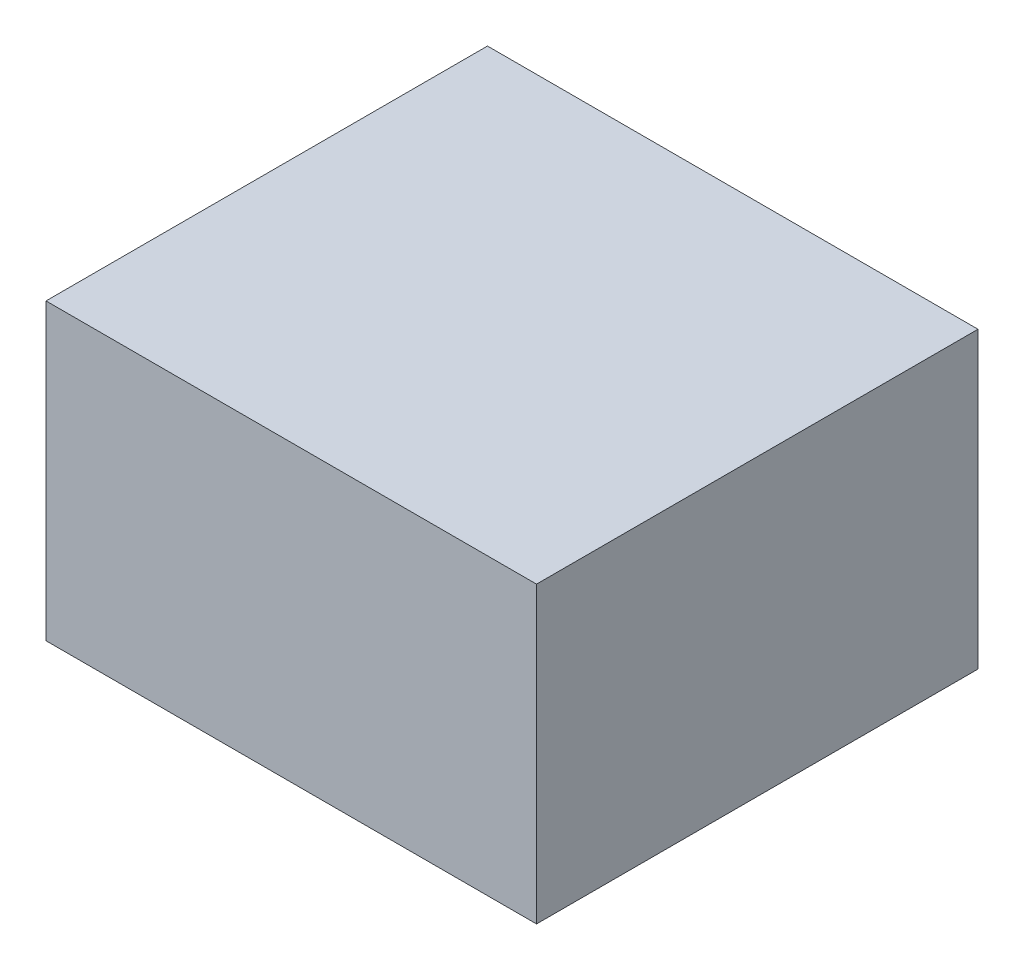
ISO-10303-21;
HEADER;
FILE_DESCRIPTION(('STEP AP214'),'2;1');
FILE_NAME('part.step','',(''),(''),'','','');
FILE_SCHEMA(('AUTOMOTIVE_DESIGN { 1 0 10303 214 1 1 1 1 }'));
ENDSEC;
DATA;
#1=APPLICATION_CONTEXT('core data for automotive mechanical design processes');
#2=APPLICATION_PROTOCOL_DEFINITION('international standard','automotive_design',2000,#1);
#3=PRODUCT_CONTEXT('',#1,'mechanical');
#4=PRODUCT('Part','Part','',(#3));
#5=PRODUCT_RELATED_PRODUCT_CATEGORY('part','',(#4));
#6=PRODUCT_DEFINITION_FORMATION('','',#4);
#7=PRODUCT_DEFINITION_CONTEXT('part definition',#1,'design');
#8=PRODUCT_DEFINITION('design','',#6,#7);
#9=PRODUCT_DEFINITION_SHAPE('','',#8);
#10=(LENGTH_UNIT() NAMED_UNIT(*) SI_UNIT(.MILLI.,.METRE.));
#11=(NAMED_UNIT(*) PLANE_ANGLE_UNIT() SI_UNIT($,.RADIAN.));
#12=(NAMED_UNIT(*) SI_UNIT($,.STERADIAN.) SOLID_ANGLE_UNIT());
#13=UNCERTAINTY_MEASURE_WITH_UNIT(LENGTH_MEASURE(1.E-05),#10,'distance_accuracy_value','');
#14=(GEOMETRIC_REPRESENTATION_CONTEXT(3) GLOBAL_UNCERTAINTY_ASSIGNED_CONTEXT((#13)) GLOBAL_UNIT_ASSIGNED_CONTEXT((#10,
#11,#12)) REPRESENTATION_CONTEXT('',''));
#15=CARTESIAN_POINT('',(0.,0.,0.));
#16=DIRECTION('',(0.,0.,1.));
#17=DIRECTION('',(1.,0.,0.));
#18=AXIS2_PLACEMENT_3D('',#15,#16,#17);
#19=CARTESIAN_POINT('',(0.,60.,90.));
#20=DIRECTION('',(1.,0.,0.));
#21=DIRECTION('',(0.,1.,0.));
#22=AXIS2_PLACEMENT_3D('',#19,#20,#21);
#23=PLANE('',#22);
#24=DIRECTION('',(0.,-1.,0.));
#25=VECTOR('',#24,1.);
#26=CARTESIAN_POINT('',(0.,60.,0.));
#27=LINE('',#26,#25);
#28=CARTESIAN_POINT('',(0.,60.,0.));
#29=VERTEX_POINT('',#28);
#30=CARTESIAN_POINT('',(0.,0.,0.));
#31=VERTEX_POINT('',#30);
#32=EDGE_CURVE('E107',#29,#31,#27,.T.);
#33=ORIENTED_EDGE('',*,*,#32,.T.);
#34=DIRECTION('',(0.,0.,-1.));
#35=VECTOR('',#34,1.);
#36=CARTESIAN_POINT('',(0.,0.,90.));
#37=LINE('',#36,#35);
#38=CARTESIAN_POINT('',(0.,0.,90.));
#39=VERTEX_POINT('',#38);
#40=EDGE_CURVE('E11',#39,#31,#37,.T.);
#41=ORIENTED_EDGE('',*,*,#40,.F.);
#42=DIRECTION('',(0.,-1.,0.));
#43=VECTOR('',#42,1.);
#44=CARTESIAN_POINT('',(0.,60.,90.));
#45=LINE('',#44,#43);
#46=CARTESIAN_POINT('',(0.,60.,90.));
#47=VERTEX_POINT('',#46);
#48=EDGE_CURVE('E91',#47,#39,#45,.T.);
#49=ORIENTED_EDGE('',*,*,#48,.F.);
#50=DIRECTION('',(0.,0.,-1.));
#51=VECTOR('',#50,1.);
#52=CARTESIAN_POINT('',(0.,60.,90.));
#53=LINE('',#52,#51);
#54=EDGE_CURVE('E103',#47,#29,#53,.T.);
#55=ORIENTED_EDGE('',*,*,#54,.T.);
#56=EDGE_LOOP('',(#33,#41,#49,#55));
#57=FACE_BOUND('',#56,.T.);
#58=ADVANCED_FACE('F39',(#57),#23,.F.);
#59=CARTESIAN_POINT('',(0.,0.,90.));
#60=DIRECTION('',(0.,1.,0.));
#61=DIRECTION('',(0.,0.,1.));
#62=AXIS2_PLACEMENT_3D('',#59,#60,#61);
#63=PLANE('',#62);
#64=DIRECTION('',(1.,0.,0.));
#65=VECTOR('',#64,1.);
#66=CARTESIAN_POINT('',(0.,0.,0.));
#67=LINE('',#66,#65);
#68=CARTESIAN_POINT('',(100.,0.,0.));
#69=VERTEX_POINT('',#68);
#70=EDGE_CURVE('E96',#31,#69,#67,.T.);
#71=ORIENTED_EDGE('',*,*,#70,.T.);
#72=DIRECTION('',(0.,0.,-1.));
#73=VECTOR('',#72,1.);
#74=CARTESIAN_POINT('',(100.,0.,90.));
#75=LINE('',#74,#73);
#76=CARTESIAN_POINT('',(100.,0.,90.));
#77=VERTEX_POINT('',#76);
#78=EDGE_CURVE('E48',#77,#69,#75,.T.);
#79=ORIENTED_EDGE('',*,*,#78,.F.);
#80=DIRECTION('',(1.,0.,0.));
#81=VECTOR('',#80,1.);
#82=CARTESIAN_POINT('',(0.,0.,90.));
#83=LINE('',#82,#81);
#84=EDGE_CURVE('E86',#39,#77,#83,.T.);
#85=ORIENTED_EDGE('',*,*,#84,.F.);
#86=ORIENTED_EDGE('',*,*,#40,.T.);
#87=EDGE_LOOP('',(#71,#79,#85,#86));
#88=FACE_BOUND('',#87,.T.);
#89=ADVANCED_FACE('F95',(#88),#63,.F.);
#90=CARTESIAN_POINT('',(100.,0.,90.));
#91=DIRECTION('',(-1.,0.,0.));
#92=DIRECTION('',(0.,0.,1.));
#93=AXIS2_PLACEMENT_3D('',#90,#91,#92);
#94=PLANE('',#93);
#95=DIRECTION('',(0.,1.,0.));
#96=VECTOR('',#95,1.);
#97=CARTESIAN_POINT('',(100.,0.,0.));
#98=LINE('',#97,#96);
#99=CARTESIAN_POINT('',(100.,60.,0.));
#100=VERTEX_POINT('',#99);
#101=EDGE_CURVE('E73',#69,#100,#98,.T.);
#102=ORIENTED_EDGE('',*,*,#101,.T.);
#103=DIRECTION('',(0.,0.,-1.));
#104=VECTOR('',#103,1.);
#105=CARTESIAN_POINT('',(100.,60.,90.));
#106=LINE('',#105,#104);
#107=CARTESIAN_POINT('',(100.,60.,90.));
#108=VERTEX_POINT('',#107);
#109=EDGE_CURVE('E98',#108,#100,#106,.T.);
#110=ORIENTED_EDGE('',*,*,#109,.F.);
#111=DIRECTION('',(0.,1.,0.));
#112=VECTOR('',#111,1.);
#113=CARTESIAN_POINT('',(100.,0.,90.));
#114=LINE('',#113,#112);
#115=EDGE_CURVE('E89',#77,#108,#114,.T.);
#116=ORIENTED_EDGE('',*,*,#115,.F.);
#117=ORIENTED_EDGE('',*,*,#78,.T.);
#118=EDGE_LOOP('',(#102,#110,#116,#117));
#119=FACE_BOUND('',#118,.T.);
#120=ADVANCED_FACE('F99',(#119),#94,.F.);
#121=CARTESIAN_POINT('',(100.,60.,90.));
#122=DIRECTION('',(0.,-1.,0.));
#123=DIRECTION('',(1.,0.,0.));
#124=AXIS2_PLACEMENT_3D('',#121,#122,#123);
#125=PLANE('',#124);
#126=DIRECTION('',(-1.,0.,0.));
#127=VECTOR('',#126,1.);
#128=CARTESIAN_POINT('',(100.,60.,0.));
#129=LINE('',#128,#127);
#130=EDGE_CURVE('E79',#100,#29,#129,.T.);
#131=ORIENTED_EDGE('',*,*,#130,.T.);
#132=ORIENTED_EDGE('',*,*,#54,.F.);
#133=DIRECTION('',(-1.,0.,0.));
#134=VECTOR('',#133,1.);
#135=CARTESIAN_POINT('',(100.,60.,90.));
#136=LINE('',#135,#134);
#137=EDGE_CURVE('E56',#108,#47,#136,.T.);
#138=ORIENTED_EDGE('',*,*,#137,.F.);
#139=ORIENTED_EDGE('',*,*,#109,.T.);
#140=EDGE_LOOP('',(#131,#132,#138,#139));
#141=FACE_BOUND('',#140,.T.);
#142=ADVANCED_FACE('F120',(#141),#125,.F.);
#143=CARTESIAN_POINT('',(0.,0.,90.));
#144=DIRECTION('',(0.,0.,1.));
#145=DIRECTION('',(1.,0.,0.));
#146=AXIS2_PLACEMENT_3D('',#143,#144,#145);
#147=PLANE('',#146);
#148=ORIENTED_EDGE('',*,*,#48,.T.);
#149=ORIENTED_EDGE('',*,*,#84,.T.);
#150=ORIENTED_EDGE('',*,*,#115,.T.);
#151=ORIENTED_EDGE('',*,*,#137,.T.);
#152=EDGE_LOOP('',(#148,#149,#150,#151));
#153=FACE_BOUND('',#152,.T.);
#154=ADVANCED_FACE('F87',(#153),#147,.T.);
#155=CARTESIAN_POINT('',(0.,0.,0.));
#156=DIRECTION('',(0.,0.,1.));
#157=DIRECTION('',(1.,0.,0.));
#158=AXIS2_PLACEMENT_3D('',#155,#156,#157);
#159=PLANE('',#158);
#160=ORIENTED_EDGE('',*,*,#32,.F.);
#161=ORIENTED_EDGE('',*,*,#130,.F.);
#162=ORIENTED_EDGE('',*,*,#101,.F.);
#163=ORIENTED_EDGE('',*,*,#70,.F.);
#164=EDGE_LOOP('',(#160,#161,#162,#163));
#165=FACE_BOUND('',#164,.T.);
#166=ADVANCED_FACE('F123',(#165),#159,.F.);
#167=CLOSED_SHELL('',(#58,#89,#120,#142,#154,#166));
#168=MANIFOLD_SOLID_BREP('B2',#167);
#169=ADVANCED_BREP_SHAPE_REPRESENTATION('',(#18,#168),#14);
#170=SHAPE_DEFINITION_REPRESENTATION(#9,#169);
ENDSEC;
END-ISO-10303-21;
